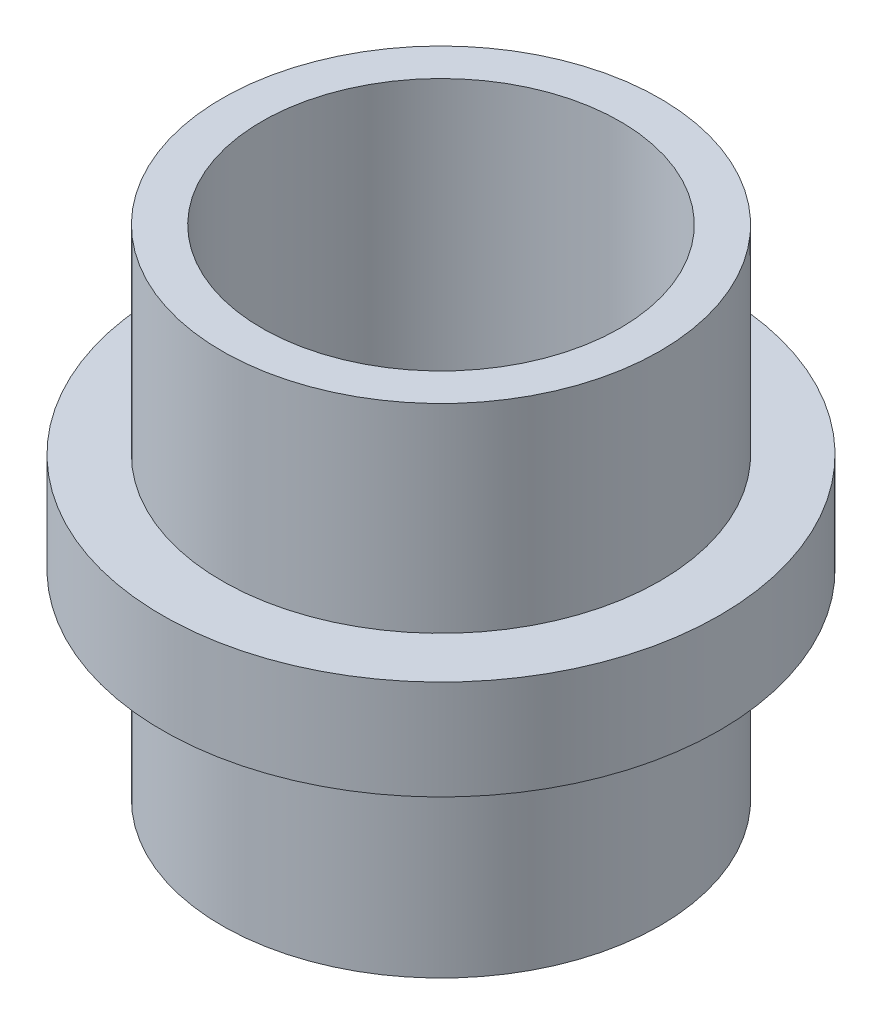
ISO-10303-21;
HEADER;
FILE_DESCRIPTION(('STEP AP214'),'2;1');
FILE_NAME('part.step','',(''),(''),'','','');
FILE_SCHEMA(('AUTOMOTIVE_DESIGN { 1 0 10303 214 1 1 1 1 }'));
ENDSEC;
DATA;
#1=APPLICATION_CONTEXT('core data for automotive mechanical design processes');
#2=APPLICATION_PROTOCOL_DEFINITION('international standard','automotive_design',2000,#1);
#3=PRODUCT_CONTEXT('',#1,'mechanical');
#4=PRODUCT('Part','Part','',(#3));
#5=PRODUCT_RELATED_PRODUCT_CATEGORY('part','',(#4));
#6=PRODUCT_DEFINITION_FORMATION('','',#4);
#7=PRODUCT_DEFINITION_CONTEXT('part definition',#1,'design');
#8=PRODUCT_DEFINITION('design','',#6,#7);
#9=PRODUCT_DEFINITION_SHAPE('','',#8);
#10=(LENGTH_UNIT() NAMED_UNIT(*) SI_UNIT(.MILLI.,.METRE.));
#11=(NAMED_UNIT(*) PLANE_ANGLE_UNIT() SI_UNIT($,.RADIAN.));
#12=(NAMED_UNIT(*) SI_UNIT($,.STERADIAN.) SOLID_ANGLE_UNIT());
#13=UNCERTAINTY_MEASURE_WITH_UNIT(LENGTH_MEASURE(1.E-05),#10,'distance_accuracy_value','');
#14=(GEOMETRIC_REPRESENTATION_CONTEXT(3) GLOBAL_UNCERTAINTY_ASSIGNED_CONTEXT((#13)) GLOBAL_UNIT_ASSIGNED_CONTEXT((#10,
#11,#12)) REPRESENTATION_CONTEXT('',''));
#15=CARTESIAN_POINT('',(0.,0.,0.));
#16=DIRECTION('',(0.,0.,1.));
#17=DIRECTION('',(1.,0.,0.));
#18=AXIS2_PLACEMENT_3D('',#15,#16,#17);
#19=CARTESIAN_POINT('',(0.,-12.5,0.));
#20=DIRECTION('',(0.,-1.,0.));
#21=DIRECTION('',(1.,0.,0.));
#22=AXIS2_PLACEMENT_3D('',#19,#20,#21);
#23=CYLINDRICAL_SURFACE('',#22,9.00000000000001);
#24=CARTESIAN_POINT('',(0.,-12.5,0.));
#25=DIRECTION('',(0.,-1.,0.));
#26=DIRECTION('',(1.,0.,0.));
#27=AXIS2_PLACEMENT_3D('',#24,#25,#26);
#28=CIRCLE('',#27,9.);
#29=CARTESIAN_POINT('',(9.,-12.5,0.));
#30=VERTEX_POINT('',#29);
#31=EDGE_CURVE('E59',#30,#30,#28,.T.);
#32=ORIENTED_EDGE('',*,*,#31,.T.);
#33=EDGE_LOOP('',(#32));
#34=FACE_BOUND('',#33,.T.);
#35=CARTESIAN_POINT('',(0.,12.5,0.));
#36=DIRECTION('',(0.,-1.,0.));
#37=DIRECTION('',(1.,0.,0.));
#38=AXIS2_PLACEMENT_3D('',#35,#36,#37);
#39=CIRCLE('',#38,9.00000000000001);
#40=CARTESIAN_POINT('',(9.,12.5,0.));
#41=VERTEX_POINT('',#40);
#42=EDGE_CURVE('E10',#41,#41,#39,.T.);
#43=ORIENTED_EDGE('',*,*,#42,.F.);
#44=EDGE_LOOP('',(#43));
#45=FACE_BOUND('',#44,.T.);
#46=ADVANCED_FACE('F31',(#34,#45),#23,.F.);
#47=CARTESIAN_POINT('',(9.,12.5,0.));
#48=DIRECTION('',(0.,1.,0.));
#49=DIRECTION('',(-1.,0.,0.));
#50=AXIS2_PLACEMENT_3D('',#47,#48,#49);
#51=PLANE('',#50);
#52=ORIENTED_EDGE('',*,*,#42,.T.);
#53=EDGE_LOOP('',(#52));
#54=FACE_BOUND('',#53,.T.);
#55=CARTESIAN_POINT('',(0.,12.5,0.));
#56=DIRECTION('',(0.,-1.,0.));
#57=DIRECTION('',(1.,0.,0.));
#58=AXIS2_PLACEMENT_3D('',#55,#56,#57);
#59=CIRCLE('',#58,11.);
#60=CARTESIAN_POINT('',(11.,12.5,0.));
#61=VERTEX_POINT('',#60);
#62=EDGE_CURVE('E37',#61,#61,#59,.T.);
#63=ORIENTED_EDGE('',*,*,#62,.F.);
#64=EDGE_LOOP('',(#63));
#65=FACE_BOUND('',#64,.T.);
#66=ADVANCED_FACE('F77',(#54,#65),#51,.T.);
#67=CARTESIAN_POINT('',(0.,-12.5,0.));
#68=DIRECTION('',(0.,-1.,0.));
#69=DIRECTION('',(1.,0.,0.));
#70=AXIS2_PLACEMENT_3D('',#67,#68,#69);
#71=CYLINDRICAL_SURFACE('',#70,11.);
#72=ORIENTED_EDGE('',*,*,#62,.T.);
#73=EDGE_LOOP('',(#72));
#74=FACE_BOUND('',#73,.T.);
#75=CARTESIAN_POINT('',(0.,2.5,0.));
#76=DIRECTION('',(0.,-1.,0.));
#77=DIRECTION('',(1.,0.,0.));
#78=AXIS2_PLACEMENT_3D('',#75,#76,#77);
#79=CIRCLE('',#78,11.);
#80=CARTESIAN_POINT('',(11.,2.5,0.));
#81=VERTEX_POINT('',#80);
#82=EDGE_CURVE('E41',#81,#81,#79,.T.);
#83=ORIENTED_EDGE('',*,*,#82,.F.);
#84=EDGE_LOOP('',(#83));
#85=FACE_BOUND('',#84,.T.);
#86=ADVANCED_FACE('F81',(#74,#85),#71,.T.);
#87=CARTESIAN_POINT('',(11.,2.5,0.));
#88=DIRECTION('',(0.,1.,0.));
#89=DIRECTION('',(-1.,0.,0.));
#90=AXIS2_PLACEMENT_3D('',#87,#88,#89);
#91=PLANE('',#90);
#92=ORIENTED_EDGE('',*,*,#82,.T.);
#93=EDGE_LOOP('',(#92));
#94=FACE_BOUND('',#93,.T.);
#95=CARTESIAN_POINT('',(0.,2.5,0.));
#96=DIRECTION('',(0.,-1.,0.));
#97=DIRECTION('',(1.,0.,0.));
#98=AXIS2_PLACEMENT_3D('',#95,#96,#97);
#99=CIRCLE('',#98,14.);
#100=CARTESIAN_POINT('',(14.,2.5,0.));
#101=VERTEX_POINT('',#100);
#102=EDGE_CURVE('E45',#101,#101,#99,.T.);
#103=ORIENTED_EDGE('',*,*,#102,.F.);
#104=EDGE_LOOP('',(#103));
#105=FACE_BOUND('',#104,.T.);
#106=ADVANCED_FACE('F85',(#94,#105),#91,.T.);
#107=CARTESIAN_POINT('',(0.,-12.5,0.));
#108=DIRECTION('',(0.,-1.,0.));
#109=DIRECTION('',(1.,0.,0.));
#110=AXIS2_PLACEMENT_3D('',#107,#108,#109);
#111=CYLINDRICAL_SURFACE('',#110,14.);
#112=ORIENTED_EDGE('',*,*,#102,.T.);
#113=EDGE_LOOP('',(#112));
#114=FACE_BOUND('',#113,.T.);
#115=CARTESIAN_POINT('',(0.,-2.5,0.));
#116=DIRECTION('',(0.,-1.,0.));
#117=DIRECTION('',(1.,0.,0.));
#118=AXIS2_PLACEMENT_3D('',#115,#116,#117);
#119=CIRCLE('',#118,14.);
#120=CARTESIAN_POINT('',(14.,-2.5,0.));
#121=VERTEX_POINT('',#120);
#122=EDGE_CURVE('E50',#121,#121,#119,.T.);
#123=ORIENTED_EDGE('',*,*,#122,.F.);
#124=EDGE_LOOP('',(#123));
#125=FACE_BOUND('',#124,.T.);
#126=ADVANCED_FACE('F91',(#114,#125),#111,.T.);
#127=CARTESIAN_POINT('',(14.,-2.5,0.));
#128=DIRECTION('',(0.,-1.,0.));
#129=DIRECTION('',(1.,0.,0.));
#130=AXIS2_PLACEMENT_3D('',#127,#128,#129);
#131=PLANE('',#130);
#132=ORIENTED_EDGE('',*,*,#122,.T.);
#133=EDGE_LOOP('',(#132));
#134=FACE_BOUND('',#133,.T.);
#135=CARTESIAN_POINT('',(0.,-2.5,0.));
#136=DIRECTION('',(0.,-1.,0.));
#137=DIRECTION('',(1.,0.,0.));
#138=AXIS2_PLACEMENT_3D('',#135,#136,#137);
#139=CIRCLE('',#138,11.);
#140=CARTESIAN_POINT('',(11.,-2.5,0.));
#141=VERTEX_POINT('',#140);
#142=EDGE_CURVE('E53',#141,#141,#139,.T.);
#143=ORIENTED_EDGE('',*,*,#142,.F.);
#144=EDGE_LOOP('',(#143));
#145=FACE_BOUND('',#144,.T.);
#146=ADVANCED_FACE('F73',(#134,#145),#131,.T.);
#147=CARTESIAN_POINT('',(0.,-12.5,0.));
#148=DIRECTION('',(0.,-1.,0.));
#149=DIRECTION('',(1.,0.,0.));
#150=AXIS2_PLACEMENT_3D('',#147,#148,#149);
#151=CYLINDRICAL_SURFACE('',#150,11.);
#152=ORIENTED_EDGE('',*,*,#142,.T.);
#153=EDGE_LOOP('',(#152));
#154=FACE_BOUND('',#153,.T.);
#155=CARTESIAN_POINT('',(0.,-12.5,0.));
#156=DIRECTION('',(0.,-1.,0.));
#157=DIRECTION('',(1.,0.,0.));
#158=AXIS2_PLACEMENT_3D('',#155,#156,#157);
#159=CIRCLE('',#158,11.);
#160=CARTESIAN_POINT('',(11.,-12.5,0.));
#161=VERTEX_POINT('',#160);
#162=EDGE_CURVE('E56',#161,#161,#159,.T.);
#163=ORIENTED_EDGE('',*,*,#162,.F.);
#164=EDGE_LOOP('',(#163));
#165=FACE_BOUND('',#164,.T.);
#166=ADVANCED_FACE('F67',(#154,#165),#151,.T.);
#167=CARTESIAN_POINT('',(11.,-12.5,0.));
#168=DIRECTION('',(0.,-1.,0.));
#169=DIRECTION('',(1.,0.,0.));
#170=AXIS2_PLACEMENT_3D('',#167,#168,#169);
#171=PLANE('',#170);
#172=ORIENTED_EDGE('',*,*,#162,.T.);
#173=EDGE_LOOP('',(#172));
#174=FACE_BOUND('',#173,.T.);
#175=ORIENTED_EDGE('',*,*,#31,.F.);
#176=EDGE_LOOP('',(#175));
#177=FACE_BOUND('',#176,.T.);
#178=ADVANCED_FACE('F65',(#174,#177),#171,.T.);
#179=CLOSED_SHELL('',(#46,#66,#86,#106,#126,#146,#166,#178));
#180=MANIFOLD_SOLID_BREP('B2',#179);
#181=ADVANCED_BREP_SHAPE_REPRESENTATION('',(#18,#180),#14);
#182=SHAPE_DEFINITION_REPRESENTATION(#9,#181);
ENDSEC;
END-ISO-10303-21;
